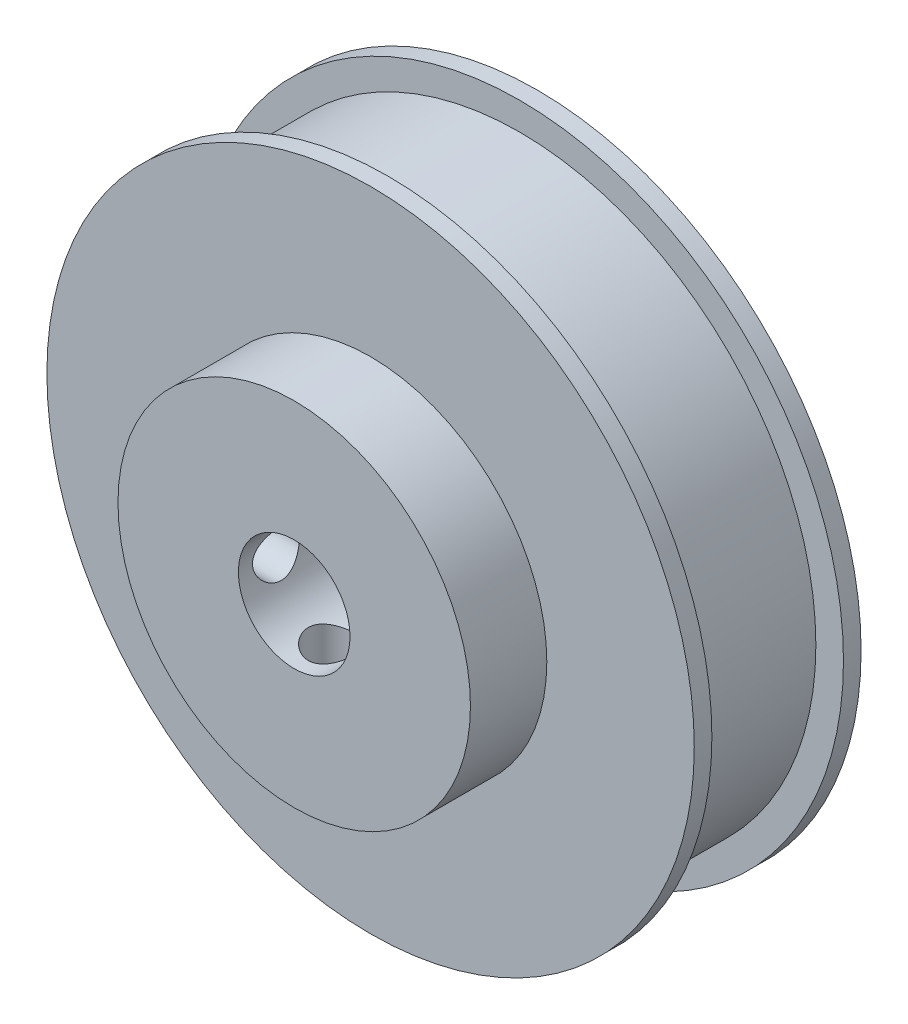
ISO-10303-21;
HEADER;
FILE_DESCRIPTION(('STEP AP214'),'2;1');
FILE_NAME('part.step','',(''),(''),'','','');
FILE_SCHEMA(('AUTOMOTIVE_DESIGN { 1 0 10303 214 1 1 1 1 }'));
ENDSEC;
DATA;
#1=APPLICATION_CONTEXT('core data for automotive mechanical design processes');
#2=APPLICATION_PROTOCOL_DEFINITION('international standard','automotive_design',2000,#1);
#3=PRODUCT_CONTEXT('',#1,'mechanical');
#4=PRODUCT('Part','Part','',(#3));
#5=PRODUCT_RELATED_PRODUCT_CATEGORY('part','',(#4));
#6=PRODUCT_DEFINITION_FORMATION('','',#4);
#7=PRODUCT_DEFINITION_CONTEXT('part definition',#1,'design');
#8=PRODUCT_DEFINITION('design','',#6,#7);
#9=PRODUCT_DEFINITION_SHAPE('','',#8);
#10=(LENGTH_UNIT() NAMED_UNIT(*) SI_UNIT(.MILLI.,.METRE.));
#11=(NAMED_UNIT(*) PLANE_ANGLE_UNIT() SI_UNIT($,.RADIAN.));
#12=(NAMED_UNIT(*) SI_UNIT($,.STERADIAN.) SOLID_ANGLE_UNIT());
#13=UNCERTAINTY_MEASURE_WITH_UNIT(LENGTH_MEASURE(1.E-05),#10,'distance_accuracy_value','');
#14=(GEOMETRIC_REPRESENTATION_CONTEXT(3) GLOBAL_UNCERTAINTY_ASSIGNED_CONTEXT((#13)) GLOBAL_UNIT_ASSIGNED_CONTEXT((#10,
#11,#12)) REPRESENTATION_CONTEXT('',''));
#15=CARTESIAN_POINT('',(0.,0.,0.));
#16=DIRECTION('',(0.,0.,1.));
#17=DIRECTION('',(1.,0.,0.));
#18=AXIS2_PLACEMENT_3D('',#15,#16,#17);
#19=CARTESIAN_POINT('',(0.,0.,14.2));
#20=DIRECTION('',(0.,0.,1.));
#21=DIRECTION('',(1.,0.,0.));
#22=AXIS2_PLACEMENT_3D('',#19,#20,#21);
#23=PLANE('',#22);
#24=CARTESIAN_POINT('',(0.,0.,14.2));
#25=DIRECTION('',(0.,0.,1.));
#26=DIRECTION('',(1.,0.,0.));
#27=AXIS2_PLACEMENT_3D('',#24,#25,#26);
#28=CIRCLE('',#27,27.55);
#29=CARTESIAN_POINT('',(27.55,0.,14.2));
#30=VERTEX_POINT('',#29);
#31=EDGE_CURVE('E144',#30,#30,#28,.T.);
#32=ORIENTED_EDGE('',*,*,#31,.T.);
#33=EDGE_LOOP('',(#32));
#34=FACE_BOUND('',#33,.T.);
#35=CARTESIAN_POINT('',(0.,0.,14.2));
#36=DIRECTION('',(0.,0.,1.));
#37=DIRECTION('',(1.,0.,0.));
#38=AXIS2_PLACEMENT_3D('',#35,#36,#37);
#39=CIRCLE('',#38,15.);
#40=CARTESIAN_POINT('',(15.,0.,14.2));
#41=VERTEX_POINT('',#40);
#42=EDGE_CURVE('E59',#41,#41,#39,.T.);
#43=ORIENTED_EDGE('',*,*,#42,.F.);
#44=EDGE_LOOP('',(#43));
#45=FACE_BOUND('',#44,.T.);
#46=ADVANCED_FACE('F31',(#34,#45),#23,.T.);
#47=CARTESIAN_POINT('',(0.,0.,1.5));
#48=DIRECTION('',(0.,0.,1.));
#49=DIRECTION('',(1.,0.,0.));
#50=AXIS2_PLACEMENT_3D('',#47,#48,#49);
#51=PLANE('',#50);
#52=CARTESIAN_POINT('',(0.,0.,1.5));
#53=DIRECTION('',(0.,0.,1.));
#54=DIRECTION('',(1.,0.,0.));
#55=AXIS2_PLACEMENT_3D('',#52,#53,#54);
#56=CIRCLE('',#55,27.55);
#57=CARTESIAN_POINT('',(27.55,0.,1.5));
#58=VERTEX_POINT('',#57);
#59=EDGE_CURVE('E10',#58,#58,#56,.T.);
#60=ORIENTED_EDGE('',*,*,#59,.T.);
#61=EDGE_LOOP('',(#60));
#62=FACE_BOUND('',#61,.T.);
#63=CARTESIAN_POINT('',(0.,0.,1.5));
#64=DIRECTION('',(0.,0.,1.));
#65=DIRECTION('',(1.,0.,0.));
#66=AXIS2_PLACEMENT_3D('',#63,#64,#65);
#67=CIRCLE('',#66,25.2);
#68=CARTESIAN_POINT('',(25.2,0.,1.5));
#69=VERTEX_POINT('',#68);
#70=EDGE_CURVE('E51',#69,#69,#67,.T.);
#71=ORIENTED_EDGE('',*,*,#70,.F.);
#72=EDGE_LOOP('',(#71));
#73=FACE_BOUND('',#72,.T.);
#74=ADVANCED_FACE('F97',(#62,#73),#51,.T.);
#75=CARTESIAN_POINT('',(0.,0.,1.5));
#76=DIRECTION('',(0.,0.,-1.));
#77=DIRECTION('',(-1.,0.,0.));
#78=AXIS2_PLACEMENT_3D('',#75,#76,#77);
#79=CYLINDRICAL_SURFACE('',#78,27.55);
#80=ORIENTED_EDGE('',*,*,#59,.F.);
#81=EDGE_LOOP('',(#80));
#82=FACE_BOUND('',#81,.T.);
#83=CARTESIAN_POINT('',(0.,0.,0.));
#84=DIRECTION('',(0.,0.,1.));
#85=DIRECTION('',(1.,0.,0.));
#86=AXIS2_PLACEMENT_3D('',#83,#84,#85);
#87=CIRCLE('',#86,27.55);
#88=CARTESIAN_POINT('',(27.55,0.,0.));
#89=VERTEX_POINT('',#88);
#90=EDGE_CURVE('E43',#89,#89,#87,.T.);
#91=ORIENTED_EDGE('',*,*,#90,.T.);
#92=EDGE_LOOP('',(#91));
#93=FACE_BOUND('',#92,.T.);
#94=ADVANCED_FACE('F33',(#82,#93),#79,.T.);
#95=CARTESIAN_POINT('',(0.,0.,0.));
#96=DIRECTION('',(0.,0.,1.));
#97=DIRECTION('',(1.,0.,0.));
#98=AXIS2_PLACEMENT_3D('',#95,#96,#97);
#99=PLANE('',#98);
#100=CARTESIAN_POINT('',(0.,0.,0.));
#101=DIRECTION('',(0.,0.,1.));
#102=DIRECTION('',(1.,0.,0.));
#103=AXIS2_PLACEMENT_3D('',#100,#101,#102);
#104=CIRCLE('',#103,4.75);
#105=CARTESIAN_POINT('',(4.75,0.,0.));
#106=VERTEX_POINT('',#105);
#107=EDGE_CURVE('E127',#106,#106,#104,.T.);
#108=ORIENTED_EDGE('',*,*,#107,.T.);
#109=EDGE_LOOP('',(#108));
#110=FACE_BOUND('',#109,.T.);
#111=ORIENTED_EDGE('',*,*,#90,.F.);
#112=EDGE_LOOP('',(#111));
#113=FACE_BOUND('',#112,.T.);
#114=ADVANCED_FACE('F116',(#110,#113),#99,.F.);
#115=CARTESIAN_POINT('',(0.,0.,12.7));
#116=DIRECTION('',(0.,0.,-1.));
#117=DIRECTION('',(-1.,0.,0.));
#118=AXIS2_PLACEMENT_3D('',#115,#116,#117);
#119=CYLINDRICAL_SURFACE('',#118,25.2);
#120=CARTESIAN_POINT('',(0.,0.,12.7));
#121=DIRECTION('',(0.,0.,1.));
#122=DIRECTION('',(1.,0.,0.));
#123=AXIS2_PLACEMENT_3D('',#120,#121,#122);
#124=CIRCLE('',#123,25.2);
#125=CARTESIAN_POINT('',(25.2,0.,12.7));
#126=VERTEX_POINT('',#125);
#127=EDGE_CURVE('E48',#126,#126,#124,.T.);
#128=ORIENTED_EDGE('',*,*,#127,.F.);
#129=EDGE_LOOP('',(#128));
#130=FACE_BOUND('',#129,.T.);
#131=ORIENTED_EDGE('',*,*,#70,.T.);
#132=EDGE_LOOP('',(#131));
#133=FACE_BOUND('',#132,.T.);
#134=ADVANCED_FACE('F110',(#130,#133),#119,.T.);
#135=CARTESIAN_POINT('',(0.,0.,12.7));
#136=DIRECTION('',(0.,0.,1.));
#137=DIRECTION('',(1.,0.,0.));
#138=AXIS2_PLACEMENT_3D('',#135,#136,#137);
#139=PLANE('',#138);
#140=CARTESIAN_POINT('',(0.,0.,12.7));
#141=DIRECTION('',(0.,0.,1.));
#142=DIRECTION('',(1.,0.,0.));
#143=AXIS2_PLACEMENT_3D('',#140,#141,#142);
#144=CIRCLE('',#143,27.55);
#145=CARTESIAN_POINT('',(27.55,0.,12.7));
#146=VERTEX_POINT('',#145);
#147=EDGE_CURVE('E142',#146,#146,#144,.T.);
#148=ORIENTED_EDGE('',*,*,#147,.F.);
#149=EDGE_LOOP('',(#148));
#150=FACE_BOUND('',#149,.T.);
#151=ORIENTED_EDGE('',*,*,#127,.T.);
#152=EDGE_LOOP('',(#151));
#153=FACE_BOUND('',#152,.T.);
#154=ADVANCED_FACE('F106',(#150,#153),#139,.F.);
#155=CARTESIAN_POINT('',(0.,0.,14.2));
#156=DIRECTION('',(0.,0.,-1.));
#157=DIRECTION('',(-1.,0.,0.));
#158=AXIS2_PLACEMENT_3D('',#155,#156,#157);
#159=CYLINDRICAL_SURFACE('',#158,27.55);
#160=ORIENTED_EDGE('',*,*,#31,.F.);
#161=EDGE_LOOP('',(#160));
#162=FACE_BOUND('',#161,.T.);
#163=ORIENTED_EDGE('',*,*,#147,.T.);
#164=EDGE_LOOP('',(#163));
#165=FACE_BOUND('',#164,.T.);
#166=ADVANCED_FACE('F109',(#162,#165),#159,.T.);
#167=CARTESIAN_POINT('',(0.,0.,20.7));
#168=DIRECTION('',(0.,0.,-1.));
#169=DIRECTION('',(-1.,0.,0.));
#170=AXIS2_PLACEMENT_3D('',#167,#168,#169);
#171=CYLINDRICAL_SURFACE('',#170,15.);
#172=CARTESIAN_POINT('',(-15.,0.,19.5));
#173=CARTESIAN_POINT('',(-14.9999983574254,-0.111808835669284,19.4999952902931));
#174=CARTESIAN_POINT('',(-14.9987367072719,-0.22368597927628,19.4905924620375));
#175=CARTESIAN_POINT('',(-14.993825111269,-0.444322725138079,19.4532336509504));
#176=CARTESIAN_POINT('',(-14.9901727244172,-0.553079022333037,19.4252587051029));
#177=CARTESIAN_POINT('',(-14.9808907984907,-0.764248312626984,19.3515982824586));
#178=CARTESIAN_POINT('',(-14.9752626421097,-0.866665683058493,19.3059251889616));
#179=CARTESIAN_POINT('',(-14.9626538666039,-1.0623638950303,19.1981930861937));
#180=CARTESIAN_POINT('',(-14.9556734655857,-1.15564620633703,19.1361367188335));
#181=CARTESIAN_POINT('',(-14.9410899478996,-1.33102582250468,18.9969867383958));
#182=CARTESIAN_POINT('',(-14.9334835816211,-1.41305798549586,18.9198113549915));
#183=CARTESIAN_POINT('',(-14.9185313755795,-1.56304735673102,18.7527898109233));
#184=CARTESIAN_POINT('',(-14.9111855496234,-1.63100381997221,18.6629429800042));
#185=CARTESIAN_POINT('',(-14.8975543544019,-1.75115902268907,18.472700877055));
#186=CARTESIAN_POINT('',(-14.8912731776576,-1.80329607482578,18.3722663175214));
#187=CARTESIAN_POINT('',(-14.8805258737923,-1.8899384500729,18.1639689327632));
#188=CARTESIAN_POINT('',(-14.8760596685121,-1.92444453245278,18.0561064276467));
#189=CARTESIAN_POINT('',(-14.8694793656867,-1.97464606772174,17.8366941894984));
#190=CARTESIAN_POINT('',(-14.8673514537014,-1.99045204228507,17.7251701654671));
#191=CARTESIAN_POINT('',(-14.8656465160931,-2.00314680548117,17.501033820394));
#192=CARTESIAN_POINT('',(-14.866069374204,-2.00003645633601,17.3884215491891));
#193=CARTESIAN_POINT('',(-14.8694055577299,-1.97507745939235,17.1660788699721));
#194=CARTESIAN_POINT('',(-14.8723026462234,-1.95335097531762,17.0563344701143));
#195=CARTESIAN_POINT('',(-14.8802355277475,-1.89196724634372,16.8420631632399));
#196=CARTESIAN_POINT('',(-14.8852713695413,-1.85230959261458,16.737536375245));
#197=CARTESIAN_POINT('',(-14.8969326111103,-1.75605929143191,16.5362903652928));
#198=CARTESIAN_POINT('',(-14.903562941239,-1.69941397913749,16.4395966288057));
#199=CARTESIAN_POINT('',(-14.9176623621993,-1.57083393344289,16.2570409180823));
#200=CARTESIAN_POINT('',(-14.9251314966353,-1.49889840502385,16.1711795074458));
#201=CARTESIAN_POINT('',(-14.9401389923359,-1.34110490026363,16.0120169874181));
#202=CARTESIAN_POINT('',(-14.947677435412,-1.25514170702645,15.9388201572977));
#203=CARTESIAN_POINT('',(-14.9619192381826,-1.07209417013341,15.8078779550716));
#204=CARTESIAN_POINT('',(-14.9686225954715,-0.975009794442371,15.7501326274765));
#205=CARTESIAN_POINT('',(-14.9804439374358,-0.772392219730472,15.6517308823053));
#206=CARTESIAN_POINT('',(-14.9855612720896,-0.666855578841232,15.6110814689537));
#207=CARTESIAN_POINT('',(-14.9936282590407,-0.450370924336252,15.5481106810277));
#208=CARTESIAN_POINT('',(-14.9965780268993,-0.33942319954226,15.5257883293606));
#209=CARTESIAN_POINT('',(-14.9999624137686,-0.116166903325648,15.5002415672289));
#210=CARTESIAN_POINT('',(-15.0004159384905,-0.00387503454704613,15.4968735982165));
#211=CARTESIAN_POINT('',(-14.9988079153852,0.219671617218714,15.5089516641272));
#212=CARTESIAN_POINT('',(-14.996746428686,0.330926425345661,15.5243972417824));
#213=CARTESIAN_POINT('',(-14.990351753581,0.548813715572934,15.573544653384));
#214=CARTESIAN_POINT('',(-14.9860271430292,0.655462016512041,15.6071775683222));
#215=CARTESIAN_POINT('',(-14.9755900925429,0.861605098793556,15.6916729659371));
#216=CARTESIAN_POINT('',(-14.9694775843944,0.961099607015634,15.7425361060133));
#217=CARTESIAN_POINT('',(-14.9560983737007,1.15074887861607,15.8603921555833));
#218=CARTESIAN_POINT('',(-14.9488251504572,1.2408458143966,15.9274773657133));
#219=CARTESIAN_POINT('',(-14.9339572870998,1.40855294699189,16.0757433292243));
#220=CARTESIAN_POINT('',(-14.9263626324062,1.48616257662378,16.1569247225164));
#221=CARTESIAN_POINT('',(-14.9116490247351,1.62720549423098,16.3317131426396));
#222=CARTESIAN_POINT('',(-14.904533487753,1.69054327608938,16.4253975667382));
#223=CARTESIAN_POINT('',(-14.8916413300182,1.80058351078813,16.6221594102809));
#224=CARTESIAN_POINT('',(-14.8858646793678,1.84728633510346,16.7252366199104));
#225=CARTESIAN_POINT('',(-14.8763281178008,1.92257836500746,16.9375572420277));
#226=CARTESIAN_POINT('',(-14.872562342326,1.95122028846795,17.0467816852108));
#227=CARTESIAN_POINT('',(-14.8674574869829,1.98974667143958,17.2685436321288));
#228=CARTESIAN_POINT('',(-14.8661182773134,1.99963213426781,17.3810809583244));
#229=CARTESIAN_POINT('',(-14.8660223129545,2.00034485806189,17.6053234908535));
#230=CARTESIAN_POINT('',(-14.8672452228252,1.99132219194492,17.7170282409642));
#231=CARTESIAN_POINT('',(-14.872091838742,1.95479376686689,17.9373178751039));
#232=CARTESIAN_POINT('',(-14.8757155438883,1.92728801483268,18.045902760302));
#233=CARTESIAN_POINT('',(-14.8849489027276,1.85462310332207,18.2568436832516));
#234=CARTESIAN_POINT('',(-14.890557626594,1.80947220819041,18.3592026111169));
#235=CARTESIAN_POINT('',(-14.9031304571282,1.70281342759737,18.5549158838261));
#236=CARTESIAN_POINT('',(-14.910094589966,1.64130522630428,18.648270054756));
#237=CARTESIAN_POINT('',(-14.9246596718306,1.50312448509508,18.8240896499284));
#238=CARTESIAN_POINT('',(-14.9322650575408,1.42634027226901,18.9064669477551));
#239=CARTESIAN_POINT('',(-14.9472171900166,1.26002169349824,19.0572232163615));
#240=CARTESIAN_POINT('',(-14.9545638756898,1.17048434072977,19.1255988987502));
#241=CARTESIAN_POINT('',(-14.9682063513753,0.980752987852819,19.2466671384665));
#242=CARTESIAN_POINT('',(-14.9744974642689,0.880514620743964,19.2992906665552));
#243=CARTESIAN_POINT('',(-14.9852732065897,0.672592409587328,19.3868805985451));
#244=CARTESIAN_POINT('',(-14.9897597692431,0.564916678969889,19.4218659086249));
#245=CARTESIAN_POINT('',(-14.9953572174327,0.380588408098419,19.4649480063852));
#246=CARTESIAN_POINT('',(-14.9970896363507,0.305091081955779,19.4780732435236));
#247=CARTESIAN_POINT('',(-14.9994115849077,0.153073171616112,19.4956008141655));
#248=CARTESIAN_POINT('',(-15.000001124628,0.0765525964512405,19.5000032246136));
#249=CARTESIAN_POINT('',(-15.,0.,19.5));
#250=B_SPLINE_CURVE_WITH_KNOTS('',3,(#172,#173,#174,#175,#176,#177,#178,#179,#180,#181,#182,
#183,#184,#185,#186,#187,#188,#189,#190,#191,#192,#193,#194,#195,#196,#197,#198,#199,#200,#201,
#202,#203,#204,#205,#206,#207,#208,#209,#210,#211,#212,#213,#214,#215,#216,#217,#218,#219,#220,
#221,#222,#223,#224,#225,#226,#227,#228,#229,#230,#231,#232,#233,#234,#235,#236,#237,#238,#239,
#240,#241,#242,#243,#244,#245,#246,#247,#248,#249),.UNSPECIFIED.,.T.,.F.,(4,2,2,2,2,2,2,2,2,2,2,
2,2,2,2,2,2,2,2,2,2,2,2,2,2,2,2,2,2,2,2,2,2,2,2,2,2,2,4),(0.,0.335146851305743,
0.670636430885044,1.0058916928274,1.34109292564034,1.67815978443559,2.01524447904836,
2.35362721511647,2.69199537766204,3.02835355914359,3.3646964092492,3.69884885098043,
4.0330089117585,4.36821583137897,4.70344018443797,5.0413054448485,5.37917167852296,
5.71717620202539,6.05516270391743,6.39058584992061,6.72600084354478,7.06015363396463,
7.39431917503546,7.73043274769884,8.06656158258761,8.4048770453545,8.74318495273048,
9.08050074735454,9.41779849783634,9.75242927496624,10.0870599266875,10.4215340370262,
10.756014605959,11.0930366783511,11.4301378125116,11.7686952667451,12.1068890499242,
12.3363573904731,12.5658237068544),.UNSPECIFIED.);
#251=CARTESIAN_POINT('',(-15.,0.,19.5));
#252=VERTEX_POINT('',#251);
#253=EDGE_CURVE('E60',#252,#252,#250,.T.);
#254=ORIENTED_EDGE('',*,*,#253,.T.);
#255=EDGE_LOOP('',(#254));
#256=FACE_BOUND('',#255,.T.);
#257=CARTESIAN_POINT('',(0.,-15.,19.5));
#258=CARTESIAN_POINT('',(0.111808835669287,-14.9999983574254,19.4999952902931));
#259=CARTESIAN_POINT('',(0.223685979276282,-14.9987367072719,19.4905924620375));
#260=CARTESIAN_POINT('',(0.444322725138081,-14.993825111269,19.4532336509504));
#261=CARTESIAN_POINT('',(0.553079022333039,-14.9901727244172,19.4252587051029));
#262=CARTESIAN_POINT('',(0.764248312626988,-14.9808907984907,19.3515982824585));
#263=CARTESIAN_POINT('',(0.866665683058498,-14.9752626421097,19.3059251889616));
#264=CARTESIAN_POINT('',(1.0623638950303,-14.9626538666039,19.1981930861937));
#265=CARTESIAN_POINT('',(1.15564620633703,-14.9556734655857,19.1361367188335));
#266=CARTESIAN_POINT('',(1.33102582250468,-14.9410899478996,18.9969867383958));
#267=CARTESIAN_POINT('',(1.41305798549587,-14.9334835816211,18.9198113549915));
#268=CARTESIAN_POINT('',(1.56304735673102,-14.9185313755795,18.7527898109233));
#269=CARTESIAN_POINT('',(1.63100381997222,-14.9111855496234,18.6629429800042));
#270=CARTESIAN_POINT('',(1.75115902268908,-14.8975543544019,18.472700877055));
#271=CARTESIAN_POINT('',(1.80329607482578,-14.8912731776576,18.3722663175214));
#272=CARTESIAN_POINT('',(1.88993845007291,-14.8805258737923,18.1639689327632));
#273=CARTESIAN_POINT('',(1.92444453245278,-14.8760596685121,18.0561064276467));
#274=CARTESIAN_POINT('',(1.97464606772174,-14.8694793656867,17.8366941894983));
#275=CARTESIAN_POINT('',(1.99045204228507,-14.8673514537014,17.7251701654671));
#276=CARTESIAN_POINT('',(2.00314680548118,-14.8656465160931,17.501033820394));
#277=CARTESIAN_POINT('',(2.00003645633601,-14.866069374204,17.3884215491891));
#278=CARTESIAN_POINT('',(1.97507745939235,-14.8694055577299,17.1660788699721));
#279=CARTESIAN_POINT('',(1.95335097531762,-14.8723026462234,17.0563344701143));
#280=CARTESIAN_POINT('',(1.89196724634372,-14.8802355277475,16.8420631632399));
#281=CARTESIAN_POINT('',(1.85230959261458,-14.8852713695413,16.737536375245));
#282=CARTESIAN_POINT('',(1.75605929143191,-14.8969326111103,16.5362903652928));
#283=CARTESIAN_POINT('',(1.69941397913749,-14.903562941239,16.4395966288057));
#284=CARTESIAN_POINT('',(1.57083393344289,-14.9176623621993,16.2570409180823));
#285=CARTESIAN_POINT('',(1.49889840502385,-14.9251314966353,16.1711795074458));
#286=CARTESIAN_POINT('',(1.34110490026363,-14.9401389923359,16.0120169874181));
#287=CARTESIAN_POINT('',(1.25514170702645,-14.947677435412,15.9388201572977));
#288=CARTESIAN_POINT('',(1.07209417013341,-14.9619192381826,15.8078779550716));
#289=CARTESIAN_POINT('',(0.97500979444237,-14.9686225954715,15.7501326274765));
#290=CARTESIAN_POINT('',(0.772392219730471,-14.9804439374358,15.6517308823053));
#291=CARTESIAN_POINT('',(0.666855578841231,-14.9855612720896,15.6110814689537));
#292=CARTESIAN_POINT('',(0.45037092433625,-14.9936282590407,15.5481106810277));
#293=CARTESIAN_POINT('',(0.339423199542258,-14.9965780268993,15.5257883293606));
#294=CARTESIAN_POINT('',(0.116166903325644,-14.9999624137686,15.5002415672289));
#295=CARTESIAN_POINT('',(0.00387503454704304,-15.0004159384905,15.4968735982165));
#296=CARTESIAN_POINT('',(-0.219671617218717,-14.9988079153852,15.5089516641272));
#297=CARTESIAN_POINT('',(-0.330926425345664,-14.996746428686,15.5243972417824));
#298=CARTESIAN_POINT('',(-0.548813715572937,-14.990351753581,15.573544653384));
#299=CARTESIAN_POINT('',(-0.655462016512044,-14.9860271430292,15.6071775683222));
#300=CARTESIAN_POINT('',(-0.861605098793559,-14.9755900925429,15.6916729659371));
#301=CARTESIAN_POINT('',(-0.961099607015637,-14.9694775843944,15.7425361060133));
#302=CARTESIAN_POINT('',(-1.15074887861608,-14.9560983737007,15.8603921555833));
#303=CARTESIAN_POINT('',(-1.2408458143966,-14.9488251504572,15.9274773657133));
#304=CARTESIAN_POINT('',(-1.40855294699189,-14.9339572870998,16.0757433292243));
#305=CARTESIAN_POINT('',(-1.48616257662378,-14.9263626324062,16.1569247225164));
#306=CARTESIAN_POINT('',(-1.62720549423098,-14.9116490247351,16.3317131426396));
#307=CARTESIAN_POINT('',(-1.69054327608938,-14.904533487753,16.4253975667382));
#308=CARTESIAN_POINT('',(-1.80058351078814,-14.8916413300182,16.6221594102809));
#309=CARTESIAN_POINT('',(-1.84728633510346,-14.8858646793678,16.7252366199104));
#310=CARTESIAN_POINT('',(-1.92257836500746,-14.8763281178008,16.9375572420277));
#311=CARTESIAN_POINT('',(-1.95122028846795,-14.872562342326,17.0467816852108));
#312=CARTESIAN_POINT('',(-1.98974667143959,-14.8674574869829,17.2685436321288));
#313=CARTESIAN_POINT('',(-1.99963213426782,-14.8661182773134,17.3810809583244));
#314=CARTESIAN_POINT('',(-2.00034485806189,-14.8660223129545,17.6053234908535));
#315=CARTESIAN_POINT('',(-1.99132219194492,-14.8672452228252,17.7170282409642));
#316=CARTESIAN_POINT('',(-1.95479376686689,-14.872091838742,17.9373178751039));
#317=CARTESIAN_POINT('',(-1.92728801483268,-14.8757155438883,18.045902760302));
#318=CARTESIAN_POINT('',(-1.85462310332207,-14.8849489027276,18.2568436832516));
#319=CARTESIAN_POINT('',(-1.80947220819041,-14.890557626594,18.3592026111169));
#320=CARTESIAN_POINT('',(-1.70281342759737,-14.9031304571282,18.5549158838261));
#321=CARTESIAN_POINT('',(-1.64130522630428,-14.910094589966,18.648270054756));
#322=CARTESIAN_POINT('',(-1.50312448509508,-14.9246596718306,18.8240896499284));
#323=CARTESIAN_POINT('',(-1.42634027226901,-14.9322650575408,18.9064669477551));
#324=CARTESIAN_POINT('',(-1.26002169349823,-14.9472171900166,19.0572232163615));
#325=CARTESIAN_POINT('',(-1.17048434072977,-14.9545638756898,19.1255988987503));
#326=CARTESIAN_POINT('',(-0.980752987852821,-14.9682063513753,19.2466671384665));
#327=CARTESIAN_POINT('',(-0.880514620743962,-14.9744974642689,19.2992906665552));
#328=CARTESIAN_POINT('',(-0.672592409587325,-14.9852732065897,19.3868805985451));
#329=CARTESIAN_POINT('',(-0.564916678969886,-14.9897597692431,19.4218659086249));
#330=CARTESIAN_POINT('',(-0.380588408098415,-14.9953572174327,19.4649480063852));
#331=CARTESIAN_POINT('',(-0.305091081955775,-14.9970896363507,19.4780732435236));
#332=CARTESIAN_POINT('',(-0.153073171616109,-14.9994115849077,19.4956008141655));
#333=CARTESIAN_POINT('',(-0.0765525964512377,-15.000001124628,19.5000032246136));
#334=CARTESIAN_POINT('',(0.,-15.,19.5));
#335=B_SPLINE_CURVE_WITH_KNOTS('',3,(#257,#258,#259,#260,#261,#262,#263,#264,#265,#266,#267,
#268,#269,#270,#271,#272,#273,#274,#275,#276,#277,#278,#279,#280,#281,#282,#283,#284,#285,#286,
#287,#288,#289,#290,#291,#292,#293,#294,#295,#296,#297,#298,#299,#300,#301,#302,#303,#304,#305,
#306,#307,#308,#309,#310,#311,#312,#313,#314,#315,#316,#317,#318,#319,#320,#321,#322,#323,#324,
#325,#326,#327,#328,#329,#330,#331,#332,#333,#334),.UNSPECIFIED.,.T.,.F.,(4,2,2,2,2,2,2,2,2,2,2,
2,2,2,2,2,2,2,2,2,2,2,2,2,2,2,2,2,2,2,2,2,2,2,2,2,2,2,4),(0.,0.335146851305743,
0.670636430885046,1.00589169282741,1.34109292564035,1.67815978443559,2.01524447904836,
2.35362721511648,2.69199537766205,3.02835355914359,3.3646964092492,3.69884885098043,
4.0330089117585,4.36821583137898,4.70344018443797,5.0413054448485,5.37917167852296,
5.71717620202539,6.05516270391743,6.39058584992061,6.72600084354479,7.06015363396464,
7.39431917503546,7.73043274769884,8.06656158258762,8.4048770453545,8.74318495273048,
9.08050074735455,9.41779849783635,9.75242927496625,10.0870599266875,10.4215340370262,
10.756014605959,11.0930366783511,11.4301378125116,11.7686952667452,12.1068890499242,
12.3363573904731,12.5658237068544),.UNSPECIFIED.);
#336=CARTESIAN_POINT('',(0.,-15.,19.5));
#337=VERTEX_POINT('',#336);
#338=EDGE_CURVE('E53',#337,#337,#335,.T.);
#339=ORIENTED_EDGE('',*,*,#338,.T.);
#340=EDGE_LOOP('',(#339));
#341=FACE_BOUND('',#340,.T.);
#342=CARTESIAN_POINT('',(0.,0.,20.7));
#343=DIRECTION('',(0.,0.,1.));
#344=DIRECTION('',(1.,0.,0.));
#345=AXIS2_PLACEMENT_3D('',#342,#343,#344);
#346=CIRCLE('',#345,15.);
#347=CARTESIAN_POINT('',(15.,0.,20.7));
#348=VERTEX_POINT('',#347);
#349=EDGE_CURVE('E140',#348,#348,#346,.T.);
#350=ORIENTED_EDGE('',*,*,#349,.F.);
#351=EDGE_LOOP('',(#350));
#352=FACE_BOUND('',#351,.T.);
#353=ORIENTED_EDGE('',*,*,#42,.T.);
#354=EDGE_LOOP('',(#353));
#355=FACE_BOUND('',#354,.T.);
#356=ADVANCED_FACE('F61',(#256,#341,#352,#355),#171,.T.);
#357=CARTESIAN_POINT('',(0.,0.,20.7));
#358=DIRECTION('',(0.,0.,1.));
#359=DIRECTION('',(1.,0.,0.));
#360=AXIS2_PLACEMENT_3D('',#357,#358,#359);
#361=PLANE('',#360);
#362=CARTESIAN_POINT('',(0.,0.,20.7));
#363=DIRECTION('',(0.,0.,1.));
#364=DIRECTION('',(1.,0.,0.));
#365=AXIS2_PLACEMENT_3D('',#362,#363,#364);
#366=CIRCLE('',#365,4.75);
#367=CARTESIAN_POINT('',(4.75,0.,20.7));
#368=VERTEX_POINT('',#367);
#369=EDGE_CURVE('E80',#368,#368,#366,.T.);
#370=ORIENTED_EDGE('',*,*,#369,.F.);
#371=EDGE_LOOP('',(#370));
#372=FACE_BOUND('',#371,.T.);
#373=ORIENTED_EDGE('',*,*,#349,.T.);
#374=EDGE_LOOP('',(#373));
#375=FACE_BOUND('',#374,.T.);
#376=ADVANCED_FACE('F69',(#372,#375),#361,.T.);
#377=CARTESIAN_POINT('',(0.,-27.55,17.5));
#378=DIRECTION('',(0.,1.,0.));
#379=DIRECTION('',(0.,0.,1.));
#380=AXIS2_PLACEMENT_3D('',#377,#378,#379);
#381=CYLINDRICAL_SURFACE('',#380,2.);
#382=CARTESIAN_POINT('',(0.,-4.75,19.5));
#383=CARTESIAN_POINT('',(0.10703646236846,-4.74999105230106,19.49998814533));
#384=CARTESIAN_POINT('',(0.214236246167392,-4.7463402994097,19.4913565895315));
#385=CARTESIAN_POINT('',(0.425593131869904,-4.73208882609393,19.4571391510735));
#386=CARTESIAN_POINT('',(0.529741661649223,-4.7214701827862,19.4315095440171));
#387=CARTESIAN_POINT('',(0.731590406184855,-4.69442284735135,19.3644147945537));
#388=CARTESIAN_POINT('',(0.829311330167876,-4.67801402078023,19.3230037583225));
#389=CARTESIAN_POINT('',(1.01632284675021,-4.64097919078582,19.2257473571231));
#390=CARTESIAN_POINT('',(1.10561588355067,-4.62035441557184,19.1699061947558));
#391=CARTESIAN_POINT('',(1.27793883653739,-4.57576887526126,19.0423656992795));
#392=CARTESIAN_POINT('',(1.36048223127562,-4.55169736788395,18.9700480867997));
#393=CARTESIAN_POINT('',(1.51268912853783,-4.50340541179333,18.81291550367));
#394=CARTESIAN_POINT('',(1.58234571599153,-4.47918489027961,18.7280938669603));
#395=CARTESIAN_POINT('',(1.71027969557346,-4.43196710928289,18.543171836268));
#396=CARTESIAN_POINT('',(1.76780496391064,-4.40909335958272,18.4425162424037));
#397=CARTESIAN_POINT('',(1.86489069620242,-4.36892020968374,18.2318559560335));
#398=CARTESIAN_POINT('',(1.90446060785823,-4.35161787932547,18.1218562164644));
#399=CARTESIAN_POINT('',(1.96249248078311,-4.32574780180008,17.9012307350763));
#400=CARTESIAN_POINT('',(1.98189190257055,-4.31679434717452,17.7908985723402));
#401=CARTESIAN_POINT('',(2.00195562895775,-4.30752932662971,17.5682098561765));
#402=CARTESIAN_POINT('',(2.00263058226539,-4.30721284881606,17.4558544897403));
#403=CARTESIAN_POINT('',(1.98593120072108,-4.31493181644961,17.2417391267059));
#404=CARTESIAN_POINT('',(1.96997131078922,-4.32231278335099,17.1398404376461));
#405=CARTESIAN_POINT('',(1.92283162811083,-4.34348696653289,16.9403306214134));
#406=CARTESIAN_POINT('',(1.89164884741754,-4.35728144163054,16.8427203400698));
#407=CARTESIAN_POINT('',(1.81433790634179,-4.39004171904363,16.652066315206));
#408=CARTESIAN_POINT('',(1.76790298398402,-4.40911227810592,16.5591657763444));
#409=CARTESIAN_POINT('',(1.66162325591989,-4.45025281005121,16.3821089440219));
#410=CARTESIAN_POINT('',(1.60177309979156,-4.47232397828682,16.2979561590997));
#411=CARTESIAN_POINT('',(1.46428805277278,-4.51930009875198,16.1331243123109));
#412=CARTESIAN_POINT('',(1.38556278942612,-4.54428505688557,16.0533749108059));
#413=CARTESIAN_POINT('',(1.21561328405726,-4.59266646060081,15.9078945918117));
#414=CARTESIAN_POINT('',(1.12438599890452,-4.61606251734623,15.8421670973995));
#415=CARTESIAN_POINT('',(0.929145948219356,-4.65933566537717,15.7251934799301));
#416=CARTESIAN_POINT('',(0.824878687890049,-4.67911472030857,15.6743331679441));
#417=CARTESIAN_POINT('',(0.608222262411324,-4.7121696275971,15.5912027892268));
#418=CARTESIAN_POINT('',(0.495837723966101,-4.72544915152312,15.5589222250242));
#419=CARTESIAN_POINT('',(0.273899430083203,-4.7433183819797,15.5158312001314));
#420=CARTESIAN_POINT('',(0.164628362907149,-4.74841197266554,15.5037735937097));
#421=CARTESIAN_POINT('',(-0.0544859422097751,-4.7509495140171,15.4977431122997));
#422=CARTESIAN_POINT('',(-0.164329001896026,-4.74839572034202,15.5037649046447));
#423=CARTESIAN_POINT('',(-0.375578198064441,-4.73625128095379,15.5328362848694));
#424=CARTESIAN_POINT('',(-0.477129162603385,-4.72702550402368,15.5550033713998));
#425=CARTESIAN_POINT('',(-0.674955484098693,-4.70285789767311,15.6145004508135));
#426=CARTESIAN_POINT('',(-0.771230176352193,-4.68791534993974,15.6518323491937));
#427=CARTESIAN_POINT('',(-0.959158229909815,-4.65316408364171,15.7418168089221));
#428=CARTESIAN_POINT('',(-1.05057430517146,-4.63321831478799,15.7949102797936));
#429=CARTESIAN_POINT('',(-1.22352777344185,-4.59058023824968,15.9144272117933));
#430=CARTESIAN_POINT('',(-1.30506098197807,-4.56788677524527,15.9808562879069));
#431=CARTESIAN_POINT('',(-1.46218525430955,-4.52014832220439,16.1308213150576));
#432=CARTESIAN_POINT('',(-1.53690971771378,-4.49505251450344,16.2152513746851));
#433=CARTESIAN_POINT('',(-1.67137911518237,-4.44680874465642,16.3958403462587));
#434=CARTESIAN_POINT('',(-1.73112037565901,-4.42366126112371,16.4920021260189));
#435=CARTESIAN_POINT('',(-1.83465029067007,-4.38175075287145,16.6954630808948));
#436=CARTESIAN_POINT('',(-1.87817619877721,-4.3630615717636,16.8029122991087));
#437=CARTESIAN_POINT('',(-1.94613970779112,-4.33317944385815,17.0246509697204));
#438=CARTESIAN_POINT('',(-1.97059349891389,-4.32198014009814,17.138934531542));
#439=CARTESIAN_POINT('',(-1.99809365532077,-4.30933055153168,17.3614609279863));
#440=CARTESIAN_POINT('',(-2.00266563478006,-4.30718588214918,17.4694765391154));
#441=CARTESIAN_POINT('',(-1.99436289136938,-4.31103684419066,17.6846758624691));
#442=CARTESIAN_POINT('',(-1.98149098638983,-4.31703116084065,17.7918597062449));
#443=CARTESIAN_POINT('',(-1.93995635081153,-4.33584430782861,17.9969853911048));
#444=CARTESIAN_POINT('',(-1.91209039204409,-4.34831777145251,18.095123302676));
#445=CARTESIAN_POINT('',(-1.84214689268935,-4.37840569203651,18.2853485056974));
#446=CARTESIAN_POINT('',(-1.80006534139776,-4.39602159966499,18.3774340808083));
#447=CARTESIAN_POINT('',(-1.69994007024285,-4.43573763071445,18.5590575441296));
#448=CARTESIAN_POINT('',(-1.64108110570074,-4.45804534068644,18.6480997388539));
#449=CARTESIAN_POINT('',(-1.51020038304186,-4.5040651794814,18.81552056148));
#450=CARTESIAN_POINT('',(-1.43817390715273,-4.52777780960673,18.8938953497547));
#451=CARTESIAN_POINT('',(-1.27659022248803,-4.57607254723289,19.0438109838857));
#452=CARTESIAN_POINT('',(-1.1861231154911,-4.60058638516999,19.1143977562201));
#453=CARTESIAN_POINT('',(-0.993725379452196,-4.64594055900097,19.23944489544));
#454=CARTESIAN_POINT('',(-0.891789570387901,-4.66677922394583,19.2938979345963));
#455=CARTESIAN_POINT('',(-0.680840837781723,-4.70215008458216,19.3839868860328));
#456=CARTESIAN_POINT('',(-0.571965756964756,-4.71677703656465,19.4199074725507));
#457=CARTESIAN_POINT('',(-0.349166725075989,-4.73846042696525,19.4725872752913));
#458=CARTESIAN_POINT('',(-0.235259686811355,-4.74554047417122,19.4894062574434));
#459=CARTESIAN_POINT('',(-0.0806138559737783,-4.74949001252044,19.4987858990016));
#460=CARTESIAN_POINT('',(-0.0403185146594521,-4.75000337042091,19.5000044654193));
#461=CARTESIAN_POINT('',(0.,-4.75,19.5));
#462=B_SPLINE_CURVE_WITH_KNOTS('',3,(#382,#383,#384,#385,#386,#387,#388,#389,#390,#391,#392,
#393,#394,#395,#396,#397,#398,#399,#400,#401,#402,#403,#404,#405,#406,#407,#408,#409,#410,#411,
#412,#413,#414,#415,#416,#417,#418,#419,#420,#421,#422,#423,#424,#425,#426,#427,#428,#429,#430,
#431,#432,#433,#434,#435,#436,#437,#438,#439,#440,#441,#442,#443,#444,#445,#446,#447,#448,#449,
#450,#451,#452,#453,#454,#455,#456,#457,#458,#459,#460,#461),.UNSPECIFIED.,.T.,.F.,(4,2,2,2,2,2,
2,2,2,2,2,2,2,2,2,2,2,2,2,2,2,2,2,2,2,2,2,2,2,2,2,2,2,2,2,2,2,2,2,4),(0.,0.320992833427258,
0.642814581763423,0.963542757751977,1.2841776305755,1.61977067727506,1.95554328441994,
2.30826935782325,2.66080961894182,2.9961126713667,3.33122503119565,3.63999866694789,
3.94883293312584,4.26430374352242,4.57990059829875,4.92278837411685,5.26575976135261,
5.61697022291763,5.96798205692135,6.29642217319481,6.62476542288597,6.93639255342286,
7.24805885281149,7.56943103565565,7.89093881783372,8.23588662956778,8.58091893324744,
8.93132109614983,9.28142547982679,9.60412990992077,9.92678221645597,10.2337737894146,
10.5408520476219,10.8666093059307,11.1924835089913,11.5428100141678,11.8932953899747,
12.2382234684013,12.5820693217041,12.7029809622212),.UNSPECIFIED.);
#463=CARTESIAN_POINT('',(0.,-4.75,19.5));
#464=VERTEX_POINT('',#463);
#465=EDGE_CURVE('E74',#464,#464,#462,.T.);
#466=ORIENTED_EDGE('',*,*,#465,.T.);
#467=EDGE_LOOP('',(#466));
#468=FACE_BOUND('',#467,.T.);
#469=ORIENTED_EDGE('',*,*,#338,.F.);
#470=EDGE_LOOP('',(#469));
#471=FACE_BOUND('',#470,.T.);
#472=ADVANCED_FACE('F65',(#468,#471),#381,.F.);
#473=CARTESIAN_POINT('',(-27.55,0.,17.5));
#474=DIRECTION('',(1.,0.,0.));
#475=DIRECTION('',(0.,0.,-1.));
#476=AXIS2_PLACEMENT_3D('',#473,#474,#475);
#477=CYLINDRICAL_SURFACE('',#476,2.);
#478=CARTESIAN_POINT('',(-4.75,0.,15.5));
#479=CARTESIAN_POINT('',(-4.74999105230106,0.107036462368456,15.50001185467));
#480=CARTESIAN_POINT('',(-4.7463402994097,0.214236246167387,15.5086434104685));
#481=CARTESIAN_POINT('',(-4.73208882609393,0.425593131869898,15.5428608489265));
#482=CARTESIAN_POINT('',(-4.7214701827862,0.529741661649217,15.568490455983));
#483=CARTESIAN_POINT('',(-4.69442284735135,0.731590406184849,15.6355852054463));
#484=CARTESIAN_POINT('',(-4.67801402078023,0.829311330167871,15.6769962416775));
#485=CARTESIAN_POINT('',(-4.64097919078582,1.01632284675021,15.7742526428769));
#486=CARTESIAN_POINT('',(-4.62035441557184,1.10561588355067,15.8300938052442));
#487=CARTESIAN_POINT('',(-4.57576887526126,1.27793883653739,15.9576343007205));
#488=CARTESIAN_POINT('',(-4.55169736788395,1.36048223127562,16.0299519132003));
#489=CARTESIAN_POINT('',(-4.50340541179333,1.51268912853782,16.18708449633));
#490=CARTESIAN_POINT('',(-4.47918489027961,1.58234571599153,16.2719061330397));
#491=CARTESIAN_POINT('',(-4.43196710928289,1.71027969557345,16.456828163732));
#492=CARTESIAN_POINT('',(-4.40909335958272,1.76780496391063,16.5574837575963));
#493=CARTESIAN_POINT('',(-4.36892020968375,1.86489069620241,16.7681440439665));
#494=CARTESIAN_POINT('',(-4.35161787932547,1.90446060785822,16.8781437835356));
#495=CARTESIAN_POINT('',(-4.32574780180008,1.9624924807831,17.0987692649237));
#496=CARTESIAN_POINT('',(-4.31679434717452,1.98189190257055,17.2091014276598));
#497=CARTESIAN_POINT('',(-4.30752932662971,2.00195562895774,17.4317901438235));
#498=CARTESIAN_POINT('',(-4.30721284881607,2.00263058226538,17.5441455102597));
#499=CARTESIAN_POINT('',(-4.31493181644962,1.98593120072107,17.7582608732941));
#500=CARTESIAN_POINT('',(-4.32231278335099,1.96997131078922,17.8601595623539));
#501=CARTESIAN_POINT('',(-4.3434869665329,1.92283162811082,18.0596693785866));
#502=CARTESIAN_POINT('',(-4.35728144163054,1.89164884741754,18.1572796599302));
#503=CARTESIAN_POINT('',(-4.39004171904363,1.81433790634178,18.347933684794));
#504=CARTESIAN_POINT('',(-4.40911227810592,1.76790298398401,18.4408342236556));
#505=CARTESIAN_POINT('',(-4.45025281005121,1.66162325591989,18.6178910559781));
#506=CARTESIAN_POINT('',(-4.47232397828682,1.60177309979156,18.7020438409003));
#507=CARTESIAN_POINT('',(-4.51930009875198,1.46428805277278,18.8668756876891));
#508=CARTESIAN_POINT('',(-4.54428505688558,1.38556278942612,18.9466250891941));
#509=CARTESIAN_POINT('',(-4.59266646060081,1.21561328405725,19.0921054081883));
#510=CARTESIAN_POINT('',(-4.61606251734623,1.12438599890452,19.1578329026005));
#511=CARTESIAN_POINT('',(-4.65933566537717,0.929145948219351,19.2748065200699));
#512=CARTESIAN_POINT('',(-4.67911472030857,0.824878687890044,19.3256668320559));
#513=CARTESIAN_POINT('',(-4.7121696275971,0.60822226241132,19.4087972107732));
#514=CARTESIAN_POINT('',(-4.72544915152312,0.495837723966097,19.4410777749758));
#515=CARTESIAN_POINT('',(-4.7433183819797,0.273899430083201,19.4841687998687));
#516=CARTESIAN_POINT('',(-4.74841197266554,0.164628362907147,19.4962264062904));
#517=CARTESIAN_POINT('',(-4.7509495140171,-0.0544859422097771,19.5022568877003));
#518=CARTESIAN_POINT('',(-4.74839572034202,-0.164329001896028,19.4962350953553));
#519=CARTESIAN_POINT('',(-4.73625128095379,-0.375578198064443,19.4671637151306));
#520=CARTESIAN_POINT('',(-4.72702550402368,-0.477129162603387,19.4449966286003));
#521=CARTESIAN_POINT('',(-4.70285789767311,-0.674955484098694,19.3854995491865));
#522=CARTESIAN_POINT('',(-4.68791534993974,-0.771230176352195,19.3481676508063));
#523=CARTESIAN_POINT('',(-4.65316408364171,-0.959158229909816,19.2581831910779));
#524=CARTESIAN_POINT('',(-4.63321831478799,-1.05057430517146,19.2050897202064));
#525=CARTESIAN_POINT('',(-4.59058023824968,-1.22352777344185,19.0855727882067));
#526=CARTESIAN_POINT('',(-4.56788677524527,-1.30506098197807,19.0191437120932));
#527=CARTESIAN_POINT('',(-4.52014832220439,-1.46218525430955,18.8691786849425));
#528=CARTESIAN_POINT('',(-4.49505251450344,-1.53690971771378,18.7847486253149));
#529=CARTESIAN_POINT('',(-4.44680874465642,-1.67137911518237,18.6041596537413));
#530=CARTESIAN_POINT('',(-4.42366126112371,-1.73112037565902,18.5079978739811));
#531=CARTESIAN_POINT('',(-4.38175075287145,-1.83465029067007,18.3045369191052));
#532=CARTESIAN_POINT('',(-4.3630615717636,-1.87817619877721,18.1970877008913));
#533=CARTESIAN_POINT('',(-4.33317944385815,-1.94613970779112,17.9753490302796));
#534=CARTESIAN_POINT('',(-4.32198014009814,-1.9705934989139,17.861065468458));
#535=CARTESIAN_POINT('',(-4.30933055153168,-1.99809365532078,17.6385390720137));
#536=CARTESIAN_POINT('',(-4.30718588214918,-2.00266563478007,17.5305234608846));
#537=CARTESIAN_POINT('',(-4.31103684419065,-1.99436289136938,17.3153241375309));
#538=CARTESIAN_POINT('',(-4.31703116084065,-1.98149098638983,17.2081402937551));
#539=CARTESIAN_POINT('',(-4.33584430782861,-1.93995635081154,17.0030146088952));
#540=CARTESIAN_POINT('',(-4.34831777145251,-1.91209039204409,16.904876697324));
#541=CARTESIAN_POINT('',(-4.37840569203651,-1.84214689268935,16.7146514943026));
#542=CARTESIAN_POINT('',(-4.39602159966499,-1.80006534139776,16.6225659191917));
#543=CARTESIAN_POINT('',(-4.43573763071445,-1.69994007024286,16.4409424558704));
#544=CARTESIAN_POINT('',(-4.45804534068644,-1.64108110570075,16.3519002611461));
#545=CARTESIAN_POINT('',(-4.5040651794814,-1.51020038304187,16.18447943852));
#546=CARTESIAN_POINT('',(-4.52777780960673,-1.43817390715273,16.1061046502453));
#547=CARTESIAN_POINT('',(-4.57607254723289,-1.27659022248804,15.9561890161143));
#548=CARTESIAN_POINT('',(-4.60058638516999,-1.18612311549111,15.8856022437799));
#549=CARTESIAN_POINT('',(-4.64594055900097,-0.993725379452203,15.76055510456));
#550=CARTESIAN_POINT('',(-4.66677922394583,-0.891789570387909,15.7061020654038));
#551=CARTESIAN_POINT('',(-4.70215008458215,-0.680840837781732,15.6160131139673));
#552=CARTESIAN_POINT('',(-4.71677703656465,-0.571965756964764,15.5800925274493));
#553=CARTESIAN_POINT('',(-4.73846042696525,-0.349166725075997,15.5274127247087));
#554=CARTESIAN_POINT('',(-4.74554047417122,-0.235259686811362,15.5105937425567));
#555=CARTESIAN_POINT('',(-4.74949001252044,-0.0806138559737849,15.5012141009984));
#556=CARTESIAN_POINT('',(-4.75000337042091,-0.0403185146594576,15.4999955345807));
#557=CARTESIAN_POINT('',(-4.75,0.,15.5));
#558=B_SPLINE_CURVE_WITH_KNOTS('',3,(#478,#479,#480,#481,#482,#483,#484,#485,#486,#487,#488,
#489,#490,#491,#492,#493,#494,#495,#496,#497,#498,#499,#500,#501,#502,#503,#504,#505,#506,#507,
#508,#509,#510,#511,#512,#513,#514,#515,#516,#517,#518,#519,#520,#521,#522,#523,#524,#525,#526,
#527,#528,#529,#530,#531,#532,#533,#534,#535,#536,#537,#538,#539,#540,#541,#542,#543,#544,#545,
#546,#547,#548,#549,#550,#551,#552,#553,#554,#555,#556,#557),.UNSPECIFIED.,.T.,.F.,(4,2,2,2,2,2,
2,2,2,2,2,2,2,2,2,2,2,2,2,2,2,2,2,2,2,2,2,2,2,2,2,2,2,2,2,2,2,2,2,4),(0.,0.320992833427257,
0.642814581763422,0.963542757751974,1.2841776305755,1.61977067727506,1.95554328441993,
2.30826935782324,2.66080961894182,2.99611267136669,3.33122503119564,3.63999866694788,
3.94883293312584,4.26430374352241,4.57990059829875,4.92278837411684,5.26575976135261,
5.61697022291762,5.96798205692134,6.2964221731948,6.62476542288596,6.93639255342285,
7.24805885281148,7.56943103565564,7.8909388178337,8.23588662956777,8.58091893324743,
8.93132109614982,9.28142547982677,9.60412990992076,9.92678221645595,10.2337737894146,
10.5408520476219,10.8666093059307,11.1924835089913,11.5428100141678,11.8932953899746,
12.2382234684013,12.5820693217041,12.7029809622212),.UNSPECIFIED.);
#559=CARTESIAN_POINT('',(-4.75,0.,15.5));
#560=VERTEX_POINT('',#559);
#561=EDGE_CURVE('E35',#560,#560,#558,.T.);
#562=ORIENTED_EDGE('',*,*,#561,.T.);
#563=EDGE_LOOP('',(#562));
#564=FACE_BOUND('',#563,.T.);
#565=ORIENTED_EDGE('',*,*,#253,.F.);
#566=EDGE_LOOP('',(#565));
#567=FACE_BOUND('',#566,.T.);
#568=ADVANCED_FACE('F68',(#564,#567),#477,.F.);
#569=CARTESIAN_POINT('',(0.,0.,0.));
#570=DIRECTION('',(0.,0.,1.));
#571=DIRECTION('',(1.,0.,0.));
#572=AXIS2_PLACEMENT_3D('',#569,#570,#571);
#573=CYLINDRICAL_SURFACE('',#572,4.75);
#574=ORIENTED_EDGE('',*,*,#561,.F.);
#575=EDGE_LOOP('',(#574));
#576=FACE_BOUND('',#575,.T.);
#577=ORIENTED_EDGE('',*,*,#107,.F.);
#578=EDGE_LOOP('',(#577));
#579=FACE_BOUND('',#578,.T.);
#580=ORIENTED_EDGE('',*,*,#369,.T.);
#581=EDGE_LOOP('',(#580));
#582=FACE_BOUND('',#581,.T.);
#583=ORIENTED_EDGE('',*,*,#465,.F.);
#584=EDGE_LOOP('',(#583));
#585=FACE_BOUND('',#584,.T.);
#586=ADVANCED_FACE('F85',(#576,#579,#582,#585),#573,.F.);
#587=CLOSED_SHELL('',(#46,#74,#94,#114,#134,#154,#166,#356,#376,#472,#568,#586));
#588=MANIFOLD_SOLID_BREP('B2',#587);
#589=ADVANCED_BREP_SHAPE_REPRESENTATION('',(#18,#588),#14);
#590=SHAPE_DEFINITION_REPRESENTATION(#9,#589);
ENDSEC;
END-ISO-10303-21;
